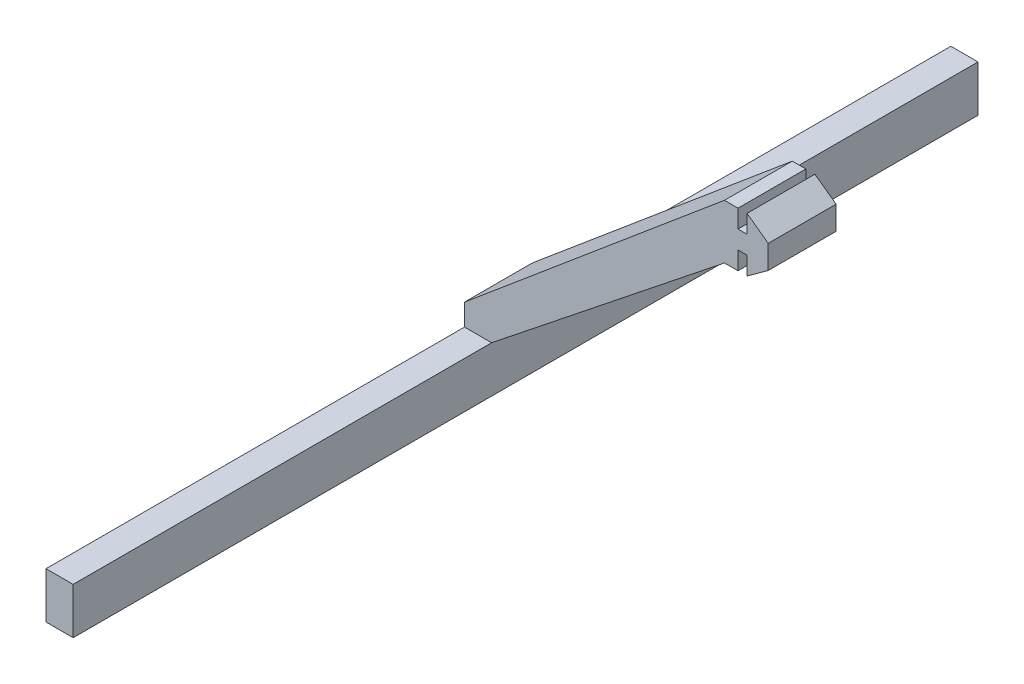
ISO-10303-21;
HEADER;
FILE_DESCRIPTION(('STEP AP214'),'2;1');
FILE_NAME('part.step','',(''),(''),'','','');
FILE_SCHEMA(('AUTOMOTIVE_DESIGN { 1 0 10303 214 1 1 1 1 }'));
ENDSEC;
DATA;
#1=APPLICATION_CONTEXT('core data for automotive mechanical design processes');
#2=APPLICATION_PROTOCOL_DEFINITION('international standard','automotive_design',2000,#1);
#3=PRODUCT_CONTEXT('',#1,'mechanical');
#4=PRODUCT('Part','Part','',(#3));
#5=PRODUCT_RELATED_PRODUCT_CATEGORY('part','',(#4));
#6=PRODUCT_DEFINITION_FORMATION('','',#4);
#7=PRODUCT_DEFINITION_CONTEXT('part definition',#1,'design');
#8=PRODUCT_DEFINITION('design','',#6,#7);
#9=PRODUCT_DEFINITION_SHAPE('','',#8);
#10=(LENGTH_UNIT() NAMED_UNIT(*) SI_UNIT(.MILLI.,.METRE.));
#11=(NAMED_UNIT(*) PLANE_ANGLE_UNIT() SI_UNIT($,.RADIAN.));
#12=(NAMED_UNIT(*) SI_UNIT($,.STERADIAN.) SOLID_ANGLE_UNIT());
#13=UNCERTAINTY_MEASURE_WITH_UNIT(LENGTH_MEASURE(1.E-05),#10,'distance_accuracy_value','');
#14=(GEOMETRIC_REPRESENTATION_CONTEXT(3) GLOBAL_UNCERTAINTY_ASSIGNED_CONTEXT((#13)) GLOBAL_UNIT_ASSIGNED_CONTEXT((#10,
#11,#12)) REPRESENTATION_CONTEXT('',''));
#15=CARTESIAN_POINT('',(0.,0.,0.));
#16=DIRECTION('',(0.,0.,1.));
#17=DIRECTION('',(1.,0.,0.));
#18=AXIS2_PLACEMENT_3D('',#15,#16,#17);
#19=CARTESIAN_POINT('',(0.,4.75939086294416,15.));
#20=DIRECTION('',(1.,0.,0.));
#21=DIRECTION('',(0.,1.,0.));
#22=AXIS2_PLACEMENT_3D('',#19,#20,#21);
#23=PLANE('',#22);
#24=DIRECTION('',(0.,0.,-1.));
#25=VECTOR('',#24,1.);
#26=CARTESIAN_POINT('',(0.,0.759390862944163,0.));
#27=LINE('',#26,#25);
#28=CARTESIAN_POINT('',(0.,0.759390862944163,15.));
#29=VERTEX_POINT('',#28);
#30=CARTESIAN_POINT('',(0.,0.759390862944163,0.));
#31=VERTEX_POINT('',#30);
#32=EDGE_CURVE('E276',#29,#31,#27,.T.);
#33=ORIENTED_EDGE('',*,*,#32,.F.);
#34=DIRECTION('',(0.,-1.,0.));
#35=VECTOR('',#34,1.);
#36=CARTESIAN_POINT('',(0.,4.75939086294416,15.));
#37=LINE('',#36,#35);
#38=CARTESIAN_POINT('',(0.,4.75939086294416,15.));
#39=VERTEX_POINT('',#38);
#40=EDGE_CURVE('E296',#39,#29,#37,.T.);
#41=ORIENTED_EDGE('',*,*,#40,.F.);
#42=DIRECTION('',(0.,0.,-1.));
#43=VECTOR('',#42,1.);
#44=CARTESIAN_POINT('',(0.,4.75939086294416,15.));
#45=LINE('',#44,#43);
#46=CARTESIAN_POINT('',(0.,4.75939086294416,0.));
#47=VERTEX_POINT('',#46);
#48=EDGE_CURVE('E306',#39,#47,#45,.T.);
#49=ORIENTED_EDGE('',*,*,#48,.T.);
#50=DIRECTION('',(0.,-1.,0.));
#51=VECTOR('',#50,1.);
#52=CARTESIAN_POINT('',(0.,4.75939086294416,0.));
#53=LINE('',#52,#51);
#54=EDGE_CURVE('E307',#47,#31,#53,.T.);
#55=ORIENTED_EDGE('',*,*,#54,.T.);
#56=EDGE_LOOP('',(#33,#41,#49,#55));
#57=FACE_BOUND('',#56,.T.);
#58=ADVANCED_FACE('F33',(#57),#23,.F.);
#59=DIRECTION('',(0.,0.,1.));
#60=VECTOR('',#59,1.);
#61=CARTESIAN_POINT('',(0.,-3.24060913705584,0.));
#62=LINE('',#61,#60);
#63=CARTESIAN_POINT('',(0.,-3.24060913705584,0.));
#64=VERTEX_POINT('',#63);
#65=CARTESIAN_POINT('',(0.,-3.24060913705584,15.));
#66=VERTEX_POINT('',#65);
#67=EDGE_CURVE('E271',#64,#66,#62,.T.);
#68=ORIENTED_EDGE('',*,*,#67,.F.);
#69=CARTESIAN_POINT('',(0.,-7.24060913705584,0.));
#70=VERTEX_POINT('',#69);
#71=EDGE_CURVE('E295',#64,#70,#53,.T.);
#72=ORIENTED_EDGE('',*,*,#71,.T.);
#73=DIRECTION('',(0.,0.,-1.));
#74=VECTOR('',#73,1.);
#75=CARTESIAN_POINT('',(0.,-7.24060913705584,15.));
#76=LINE('',#75,#74);
#77=CARTESIAN_POINT('',(0.,-7.24060913705584,15.));
#78=VERTEX_POINT('',#77);
#79=EDGE_CURVE('E11',#78,#70,#76,.T.);
#80=ORIENTED_EDGE('',*,*,#79,.F.);
#81=EDGE_CURVE('E300',#66,#78,#37,.T.);
#82=ORIENTED_EDGE('',*,*,#81,.F.);
#83=EDGE_LOOP('',(#68,#72,#80,#82));
#84=FACE_BOUND('',#83,.T.);
#85=ADVANCED_FACE('F387',(#84),#23,.F.);
#86=CARTESIAN_POINT('',(4.68,-3.84060913705584,15.));
#87=DIRECTION('',(-0.587760469668133,0.809034999425548,0.));
#88=DIRECTION('',(-0.809034999425548,-0.587760469668133,0.));
#89=AXIS2_PLACEMENT_3D('',#86,#87,#88);
#90=PLANE('',#89);
#91=DIRECTION('',(0.809034999425548,0.587760469668133,0.));
#92=VECTOR('',#91,1.);
#93=CARTESIAN_POINT('',(4.68,-3.84060913705584,0.));
#94=LINE('',#93,#92);
#95=CARTESIAN_POINT('',(4.68,-3.84060913705584,0.));
#96=VERTEX_POINT('',#95);
#97=EDGE_CURVE('E309',#70,#96,#94,.T.);
#98=ORIENTED_EDGE('',*,*,#97,.T.);
#99=DIRECTION('',(0.,0.,-1.));
#100=VECTOR('',#99,1.);
#101=CARTESIAN_POINT('',(4.68,-3.84060913705584,15.));
#102=LINE('',#101,#100);
#103=CARTESIAN_POINT('',(4.68,-3.84060913705584,15.));
#104=VERTEX_POINT('',#103);
#105=EDGE_CURVE('E40',#104,#96,#102,.T.);
#106=ORIENTED_EDGE('',*,*,#105,.F.);
#107=DIRECTION('',(0.809034999425548,0.587760469668133,0.));
#108=VECTOR('',#107,1.);
#109=CARTESIAN_POINT('',(4.68,-3.84060913705584,15.));
#110=LINE('',#109,#108);
#111=EDGE_CURVE('E299',#78,#104,#110,.T.);
#112=ORIENTED_EDGE('',*,*,#111,.F.);
#113=ORIENTED_EDGE('',*,*,#79,.T.);
#114=EDGE_LOOP('',(#98,#106,#112,#113));
#115=FACE_BOUND('',#114,.T.);
#116=ADVANCED_FACE('F388',(#115),#90,.F.);
#117=CARTESIAN_POINT('',(4.68,1.35939086294416,15.));
#118=DIRECTION('',(-1.,0.,0.));
#119=DIRECTION('',(0.,-1.,0.));
#120=AXIS2_PLACEMENT_3D('',#117,#118,#119);
#121=PLANE('',#120);
#122=DIRECTION('',(0.,1.,0.));
#123=VECTOR('',#122,1.);
#124=CARTESIAN_POINT('',(4.68,1.35939086294416,0.));
#125=LINE('',#124,#123);
#126=CARTESIAN_POINT('',(4.68,1.35939086294416,0.));
#127=VERTEX_POINT('',#126);
#128=EDGE_CURVE('E311',#96,#127,#125,.T.);
#129=ORIENTED_EDGE('',*,*,#128,.T.);
#130=DIRECTION('',(0.,0.,-1.));
#131=VECTOR('',#130,1.);
#132=CARTESIAN_POINT('',(4.68,1.35939086294416,15.));
#133=LINE('',#132,#131);
#134=CARTESIAN_POINT('',(4.68,1.35939086294416,15.));
#135=VERTEX_POINT('',#134);
#136=EDGE_CURVE('E317',#135,#127,#133,.T.);
#137=ORIENTED_EDGE('',*,*,#136,.F.);
#138=DIRECTION('',(0.,1.,0.));
#139=VECTOR('',#138,1.);
#140=CARTESIAN_POINT('',(4.68,1.35939086294416,15.));
#141=LINE('',#140,#139);
#142=EDGE_CURVE('E302',#104,#135,#141,.T.);
#143=ORIENTED_EDGE('',*,*,#142,.F.);
#144=ORIENTED_EDGE('',*,*,#105,.T.);
#145=EDGE_LOOP('',(#129,#137,#143,#144));
#146=FACE_BOUND('',#145,.T.);
#147=ADVANCED_FACE('F324',(#146),#121,.F.);
#148=CARTESIAN_POINT('',(0.,4.75939086294416,15.));
#149=DIRECTION('',(-0.587760469668133,-0.809034999425548,0.));
#150=DIRECTION('',(0.809034999425548,-0.587760469668133,0.));
#151=AXIS2_PLACEMENT_3D('',#148,#149,#150);
#152=PLANE('',#151);
#153=DIRECTION('',(-0.809034999425548,0.587760469668133,0.));
#154=VECTOR('',#153,1.);
#155=CARTESIAN_POINT('',(0.,4.75939086294416,0.));
#156=LINE('',#155,#154);
#157=EDGE_CURVE('E313',#127,#47,#156,.T.);
#158=ORIENTED_EDGE('',*,*,#157,.T.);
#159=ORIENTED_EDGE('',*,*,#48,.F.);
#160=DIRECTION('',(-0.809034999425548,0.587760469668133,0.));
#161=VECTOR('',#160,1.);
#162=CARTESIAN_POINT('',(0.,4.75939086294416,15.));
#163=LINE('',#162,#161);
#164=EDGE_CURVE('E304',#135,#39,#163,.T.);
#165=ORIENTED_EDGE('',*,*,#164,.F.);
#166=ORIENTED_EDGE('',*,*,#136,.T.);
#167=EDGE_LOOP('',(#158,#159,#165,#166));
#168=FACE_BOUND('',#167,.T.);
#169=ADVANCED_FACE('F335',(#168),#152,.F.);
#170=CARTESIAN_POINT('',(0.,0.,15.));
#171=DIRECTION('',(0.,0.,-1.));
#172=DIRECTION('',(-1.,0.,0.));
#173=AXIS2_PLACEMENT_3D('',#170,#171,#172);
#174=PLANE('',#173);
#175=DIRECTION('',(0.,1.,0.));
#176=VECTOR('',#175,1.);
#177=CARTESIAN_POINT('',(-62.4533332339231,-58.4496798635466,15.));
#178=LINE('',#177,#176);
#179=CARTESIAN_POINT('',(-62.4533332339231,-48.2296798635466,15.));
#180=VERTEX_POINT('',#179);
#181=CARTESIAN_POINT('',(-62.4533332339231,-43.4496798635466,15.));
#182=VERTEX_POINT('',#181);
#183=EDGE_CURVE('E224',#180,#182,#178,.T.);
#184=ORIENTED_EDGE('',*,*,#183,.F.);
#185=DIRECTION('',(1.,0.,0.));
#186=VECTOR('',#185,1.);
#187=CARTESIAN_POINT('',(0.,-48.2296798635466,15.));
#188=LINE('',#187,#186);
#189=CARTESIAN_POINT('',(-56.4533332339231,-48.2296798635466,15.));
#190=VERTEX_POINT('',#189);
#191=EDGE_CURVE('E212',#180,#190,#188,.T.);
#192=ORIENTED_EDGE('',*,*,#191,.T.);
#193=DIRECTION('',(0.,1.,0.));
#194=VECTOR('',#193,1.);
#195=CARTESIAN_POINT('',(-56.4533332339231,-58.4496798635466,15.));
#196=LINE('',#195,#194);
#197=CARTESIAN_POINT('',(-56.4533332339231,-48.2294046692249,15.));
#198=VERTEX_POINT('',#197);
#199=EDGE_CURVE('E186',#190,#198,#196,.T.);
#200=ORIENTED_EDGE('',*,*,#199,.T.);
#201=DIRECTION('',(-0.782156445030785,-0.623082093705801,0.));
#202=VECTOR('',#201,1.);
#203=CARTESIAN_POINT('',(-50.4533332339231,-43.4496798635466,15.));
#204=LINE('',#203,#202);
#205=CARTESIAN_POINT('',(-5.,-7.24060913705584,15.));
#206=VERTEX_POINT('',#205);
#207=EDGE_CURVE('E228',#206,#198,#204,.T.);
#208=ORIENTED_EDGE('',*,*,#207,.F.);
#209=DIRECTION('',(1.,0.,0.));
#210=VECTOR('',#209,1.);
#211=CARTESIAN_POINT('',(-5.,-7.24060913705584,15.));
#212=LINE('',#211,#210);
#213=CARTESIAN_POINT('',(-2.,-7.24060913705584,15.));
#214=VERTEX_POINT('',#213);
#215=EDGE_CURVE('E265',#206,#214,#212,.T.);
#216=ORIENTED_EDGE('',*,*,#215,.T.);
#217=DIRECTION('',(0.,1.,0.));
#218=VECTOR('',#217,1.);
#219=CARTESIAN_POINT('',(-2.,4.75939086294416,15.));
#220=LINE('',#219,#218);
#221=CARTESIAN_POINT('',(-2.,-3.24060913705584,15.));
#222=VERTEX_POINT('',#221);
#223=EDGE_CURVE('E256',#214,#222,#220,.T.);
#224=ORIENTED_EDGE('',*,*,#223,.T.);
#225=DIRECTION('',(1.,0.,0.));
#226=VECTOR('',#225,1.);
#227=CARTESIAN_POINT('',(-2.,-3.24060913705584,15.));
#228=LINE('',#227,#226);
#229=EDGE_CURVE('E289',#222,#66,#228,.T.);
#230=ORIENTED_EDGE('',*,*,#229,.T.);
#231=ORIENTED_EDGE('',*,*,#81,.T.);
#232=ORIENTED_EDGE('',*,*,#111,.T.);
#233=ORIENTED_EDGE('',*,*,#142,.T.);
#234=ORIENTED_EDGE('',*,*,#164,.T.);
#235=ORIENTED_EDGE('',*,*,#40,.T.);
#236=DIRECTION('',(1.,0.,0.));
#237=VECTOR('',#236,1.);
#238=CARTESIAN_POINT('',(-2.,0.759390862944162,15.));
#239=LINE('',#238,#237);
#240=CARTESIAN_POINT('',(-2.,0.759390862944162,15.));
#241=VERTEX_POINT('',#240);
#242=EDGE_CURVE('E286',#241,#29,#239,.T.);
#243=ORIENTED_EDGE('',*,*,#242,.F.);
#244=CARTESIAN_POINT('',(-2.,4.75939086294416,15.));
#245=VERTEX_POINT('',#244);
#246=EDGE_CURVE('E255',#241,#245,#220,.T.);
#247=ORIENTED_EDGE('',*,*,#246,.T.);
#248=DIRECTION('',(1.,0.,0.));
#249=VECTOR('',#248,1.);
#250=CARTESIAN_POINT('',(-5.,4.75939086294416,15.));
#251=LINE('',#250,#249);
#252=CARTESIAN_POINT('',(-5.,4.75939086294416,15.));
#253=VERTEX_POINT('',#252);
#254=EDGE_CURVE('E262',#253,#245,#251,.T.);
#255=ORIENTED_EDGE('',*,*,#254,.F.);
#256=DIRECTION('',(0.766044443118974,0.642787609686543,0.));
#257=VECTOR('',#256,1.);
#258=CARTESIAN_POINT('',(-5.,4.75939086294416,15.));
#259=LINE('',#258,#257);
#260=EDGE_CURVE('E231',#182,#253,#259,.T.);
#261=ORIENTED_EDGE('',*,*,#260,.F.);
#262=EDGE_LOOP('',(#184,#192,#200,#208,#216,#224,#230,#231,#232,#233,#234,#235,#243,#247,#255,#261));
#263=FACE_BOUND('',#262,.T.);
#264=ADVANCED_FACE('F341',(#263),#174,.F.);
#265=CARTESIAN_POINT('',(0.,0.,0.));
#266=DIRECTION('',(0.,0.,-1.));
#267=DIRECTION('',(-1.,0.,0.));
#268=AXIS2_PLACEMENT_3D('',#265,#266,#267);
#269=PLANE('',#268);
#270=DIRECTION('',(1.,0.,0.));
#271=VECTOR('',#270,1.);
#272=CARTESIAN_POINT('',(0.,-48.2296798635466,0.));
#273=LINE('',#272,#271);
#274=CARTESIAN_POINT('',(-62.4533332339231,-48.2296798635466,0.));
#275=VERTEX_POINT('',#274);
#276=CARTESIAN_POINT('',(-56.4533332339231,-48.2296798635466,0.));
#277=VERTEX_POINT('',#276);
#278=EDGE_CURVE('E205',#275,#277,#273,.T.);
#279=ORIENTED_EDGE('',*,*,#278,.F.);
#280=DIRECTION('',(0.,1.,0.));
#281=VECTOR('',#280,1.);
#282=CARTESIAN_POINT('',(-62.4533332339231,-58.4496798635466,0.));
#283=LINE('',#282,#281);
#284=CARTESIAN_POINT('',(-62.4533332339231,-43.4496798635466,0.));
#285=VERTEX_POINT('',#284);
#286=EDGE_CURVE('E222',#275,#285,#283,.T.);
#287=ORIENTED_EDGE('',*,*,#286,.T.);
#288=DIRECTION('',(0.766044443118974,0.642787609686543,0.));
#289=VECTOR('',#288,1.);
#290=CARTESIAN_POINT('',(-5.,4.75939086294416,0.));
#291=LINE('',#290,#289);
#292=CARTESIAN_POINT('',(-5.,4.75939086294416,0.));
#293=VERTEX_POINT('',#292);
#294=EDGE_CURVE('E232',#285,#293,#291,.T.);
#295=ORIENTED_EDGE('',*,*,#294,.T.);
#296=DIRECTION('',(1.,0.,0.));
#297=VECTOR('',#296,1.);
#298=CARTESIAN_POINT('',(-5.,4.75939086294416,0.));
#299=LINE('',#298,#297);
#300=CARTESIAN_POINT('',(-2.,4.75939086294416,0.));
#301=VERTEX_POINT('',#300);
#302=EDGE_CURVE('E249',#293,#301,#299,.T.);
#303=ORIENTED_EDGE('',*,*,#302,.T.);
#304=DIRECTION('',(0.,-1.,0.));
#305=VECTOR('',#304,1.);
#306=CARTESIAN_POINT('',(-2.,4.75939086294416,0.));
#307=LINE('',#306,#305);
#308=CARTESIAN_POINT('',(-2.,0.759390862944163,0.));
#309=VERTEX_POINT('',#308);
#310=EDGE_CURVE('E250',#301,#309,#307,.T.);
#311=ORIENTED_EDGE('',*,*,#310,.T.);
#312=DIRECTION('',(1.,0.,0.));
#313=VECTOR('',#312,1.);
#314=CARTESIAN_POINT('',(-2.,0.759390862944162,0.));
#315=LINE('',#314,#313);
#316=EDGE_CURVE('E279',#309,#31,#315,.T.);
#317=ORIENTED_EDGE('',*,*,#316,.T.);
#318=ORIENTED_EDGE('',*,*,#54,.F.);
#319=ORIENTED_EDGE('',*,*,#157,.F.);
#320=ORIENTED_EDGE('',*,*,#128,.F.);
#321=ORIENTED_EDGE('',*,*,#97,.F.);
#322=ORIENTED_EDGE('',*,*,#71,.F.);
#323=DIRECTION('',(1.,0.,0.));
#324=VECTOR('',#323,1.);
#325=CARTESIAN_POINT('',(-2.,-3.24060913705584,0.));
#326=LINE('',#325,#324);
#327=CARTESIAN_POINT('',(-2.,-3.24060913705584,0.));
#328=VERTEX_POINT('',#327);
#329=EDGE_CURVE('E292',#328,#64,#326,.T.);
#330=ORIENTED_EDGE('',*,*,#329,.F.);
#331=CARTESIAN_POINT('',(-2.,-7.24060913705584,0.));
#332=VERTEX_POINT('',#331);
#333=EDGE_CURVE('E241',#328,#332,#307,.T.);
#334=ORIENTED_EDGE('',*,*,#333,.T.);
#335=DIRECTION('',(1.,0.,0.));
#336=VECTOR('',#335,1.);
#337=CARTESIAN_POINT('',(-5.,-7.24060913705584,0.));
#338=LINE('',#337,#336);
#339=CARTESIAN_POINT('',(-5.,-7.24060913705584,0.));
#340=VERTEX_POINT('',#339);
#341=EDGE_CURVE('E268',#340,#332,#338,.T.);
#342=ORIENTED_EDGE('',*,*,#341,.F.);
#343=DIRECTION('',(-0.782156445030785,-0.623082093705801,0.));
#344=VECTOR('',#343,1.);
#345=CARTESIAN_POINT('',(-50.4533332339231,-43.4496798635466,0.));
#346=LINE('',#345,#344);
#347=CARTESIAN_POINT('',(-56.4533332339231,-48.2294046692249,0.));
#348=VERTEX_POINT('',#347);
#349=EDGE_CURVE('E227',#340,#348,#346,.T.);
#350=ORIENTED_EDGE('',*,*,#349,.T.);
#351=DIRECTION('',(0.,1.,0.));
#352=VECTOR('',#351,1.);
#353=CARTESIAN_POINT('',(-56.4533332339231,-58.4496798635466,0.));
#354=LINE('',#353,#352);
#355=EDGE_CURVE('E47',#277,#348,#354,.T.);
#356=ORIENTED_EDGE('',*,*,#355,.F.);
#357=EDGE_LOOP('',(#279,#287,#295,#303,#311,#317,#318,#319,#320,#321,#322,#330,#334,#342,#350,#356));
#358=FACE_BOUND('',#357,.T.);
#359=ADVANCED_FACE('F330',(#358),#269,.T.);
#360=CARTESIAN_POINT('',(-2.,-3.24060913705584,0.));
#361=DIRECTION('',(0.,1.,0.));
#362=DIRECTION('',(-1.,0.,0.));
#363=AXIS2_PLACEMENT_3D('',#360,#361,#362);
#364=PLANE('',#363);
#365=ORIENTED_EDGE('',*,*,#67,.T.);
#366=ORIENTED_EDGE('',*,*,#229,.F.);
#367=DIRECTION('',(0.,0.,1.));
#368=VECTOR('',#367,1.);
#369=CARTESIAN_POINT('',(-2.,-3.24060913705584,0.));
#370=LINE('',#369,#368);
#371=EDGE_CURVE('E272',#328,#222,#370,.T.);
#372=ORIENTED_EDGE('',*,*,#371,.F.);
#373=ORIENTED_EDGE('',*,*,#329,.T.);
#374=EDGE_LOOP('',(#365,#366,#372,#373));
#375=FACE_BOUND('',#374,.T.);
#376=ADVANCED_FACE('F384',(#375),#364,.F.);
#377=CARTESIAN_POINT('',(-2.,0.759390862944162,0.));
#378=DIRECTION('',(0.,-1.,0.));
#379=DIRECTION('',(1.,0.,0.));
#380=AXIS2_PLACEMENT_3D('',#377,#378,#379);
#381=PLANE('',#380);
#382=ORIENTED_EDGE('',*,*,#32,.T.);
#383=ORIENTED_EDGE('',*,*,#316,.F.);
#384=DIRECTION('',(0.,0.,-1.));
#385=VECTOR('',#384,1.);
#386=CARTESIAN_POINT('',(-2.,0.759390862944162,0.));
#387=LINE('',#386,#385);
#388=EDGE_CURVE('E275',#241,#309,#387,.T.);
#389=ORIENTED_EDGE('',*,*,#388,.F.);
#390=ORIENTED_EDGE('',*,*,#242,.T.);
#391=EDGE_LOOP('',(#382,#383,#389,#390));
#392=FACE_BOUND('',#391,.T.);
#393=ADVANCED_FACE('F344',(#392),#381,.F.);
#394=CARTESIAN_POINT('',(-2.,0.,0.));
#395=DIRECTION('',(-1.,0.,0.));
#396=DIRECTION('',(0.,-1.,0.));
#397=AXIS2_PLACEMENT_3D('',#394,#395,#396);
#398=PLANE('',#397);
#399=ORIENTED_EDGE('',*,*,#333,.F.);
#400=ORIENTED_EDGE('',*,*,#371,.T.);
#401=ORIENTED_EDGE('',*,*,#223,.F.);
#402=DIRECTION('',(0.,0.,1.));
#403=VECTOR('',#402,1.);
#404=CARTESIAN_POINT('',(-2.,-7.24060913705584,0.));
#405=LINE('',#404,#403);
#406=EDGE_CURVE('E253',#332,#214,#405,.T.);
#407=ORIENTED_EDGE('',*,*,#406,.F.);
#408=EDGE_LOOP('',(#399,#400,#401,#407));
#409=FACE_BOUND('',#408,.T.);
#410=ADVANCED_FACE('F381',(#409),#398,.F.);
#411=ORIENTED_EDGE('',*,*,#246,.F.);
#412=ORIENTED_EDGE('',*,*,#388,.T.);
#413=ORIENTED_EDGE('',*,*,#310,.F.);
#414=DIRECTION('',(0.,0.,-1.));
#415=VECTOR('',#414,1.);
#416=CARTESIAN_POINT('',(-2.,4.75939086294416,0.));
#417=LINE('',#416,#415);
#418=EDGE_CURVE('E246',#245,#301,#417,.T.);
#419=ORIENTED_EDGE('',*,*,#418,.F.);
#420=EDGE_LOOP('',(#411,#412,#413,#419));
#421=FACE_BOUND('',#420,.T.);
#422=ADVANCED_FACE('F349',(#421),#398,.F.);
#423=CARTESIAN_POINT('',(-5.,-7.24060913705584,0.));
#424=DIRECTION('',(0.,1.,0.));
#425=DIRECTION('',(-1.,0.,0.));
#426=AXIS2_PLACEMENT_3D('',#423,#424,#425);
#427=PLANE('',#426);
#428=ORIENTED_EDGE('',*,*,#406,.T.);
#429=ORIENTED_EDGE('',*,*,#215,.F.);
#430=DIRECTION('',(0.,0.,1.));
#431=VECTOR('',#430,1.);
#432=CARTESIAN_POINT('',(-5.,-7.24060913705584,0.));
#433=LINE('',#432,#431);
#434=EDGE_CURVE('E242',#340,#206,#433,.T.);
#435=ORIENTED_EDGE('',*,*,#434,.F.);
#436=ORIENTED_EDGE('',*,*,#341,.T.);
#437=EDGE_LOOP('',(#428,#429,#435,#436));
#438=FACE_BOUND('',#437,.T.);
#439=ADVANCED_FACE('F441',(#438),#427,.F.);
#440=CARTESIAN_POINT('',(-5.,4.75939086294416,0.));
#441=DIRECTION('',(0.,-1.,0.));
#442=DIRECTION('',(1.,0.,0.));
#443=AXIS2_PLACEMENT_3D('',#440,#441,#442);
#444=PLANE('',#443);
#445=ORIENTED_EDGE('',*,*,#418,.T.);
#446=ORIENTED_EDGE('',*,*,#302,.F.);
#447=DIRECTION('',(0.,0.,-1.));
#448=VECTOR('',#447,1.);
#449=CARTESIAN_POINT('',(-5.,4.75939086294416,0.));
#450=LINE('',#449,#448);
#451=EDGE_CURVE('E245',#253,#293,#450,.T.);
#452=ORIENTED_EDGE('',*,*,#451,.F.);
#453=ORIENTED_EDGE('',*,*,#254,.T.);
#454=EDGE_LOOP('',(#445,#446,#452,#453));
#455=FACE_BOUND('',#454,.T.);
#456=ADVANCED_FACE('F353',(#455),#444,.F.);
#457=CARTESIAN_POINT('',(-5.,4.75939086294416,15.));
#458=DIRECTION('',(-0.642787609686544,0.766044443118975,0.));
#459=DIRECTION('',(-0.766044443118975,-0.642787609686544,0.));
#460=AXIS2_PLACEMENT_3D('',#457,#458,#459);
#461=PLANE('',#460);
#462=ORIENTED_EDGE('',*,*,#294,.F.);
#463=DIRECTION('',(0.,0.,-1.));
#464=VECTOR('',#463,1.);
#465=CARTESIAN_POINT('',(-62.4533332339231,-43.4496798635466,15.));
#466=LINE('',#465,#464);
#467=EDGE_CURVE('E235',#182,#285,#466,.T.);
#468=ORIENTED_EDGE('',*,*,#467,.F.);
#469=ORIENTED_EDGE('',*,*,#260,.T.);
#470=ORIENTED_EDGE('',*,*,#451,.T.);
#471=EDGE_LOOP('',(#462,#468,#469,#470));
#472=FACE_BOUND('',#471,.T.);
#473=ADVANCED_FACE('F357',(#472),#461,.T.);
#474=CARTESIAN_POINT('',(-50.4533332339231,-43.4496798635466,15.));
#475=DIRECTION('',(0.623082093705801,-0.782156445030785,0.));
#476=DIRECTION('',(0.782156445030785,0.623082093705801,0.));
#477=AXIS2_PLACEMENT_3D('',#474,#475,#476);
#478=PLANE('',#477);
#479=ORIENTED_EDGE('',*,*,#349,.F.);
#480=ORIENTED_EDGE('',*,*,#434,.T.);
#481=ORIENTED_EDGE('',*,*,#207,.T.);
#482=DIRECTION('',(0.,0.,-1.));
#483=VECTOR('',#482,1.);
#484=CARTESIAN_POINT('',(-56.4533332339231,-48.2294046692249,15.));
#485=LINE('',#484,#483);
#486=EDGE_CURVE('E214',#198,#348,#485,.T.);
#487=ORIENTED_EDGE('',*,*,#486,.T.);
#488=EDGE_LOOP('',(#479,#480,#481,#487));
#489=FACE_BOUND('',#488,.T.);
#490=ADVANCED_FACE('F374',(#489),#478,.T.);
#491=CARTESIAN_POINT('',(-56.4533332339231,-58.4496798635466,15.));
#492=DIRECTION('',(-1.,0.,0.));
#493=DIRECTION('',(0.,0.,1.));
#494=AXIS2_PLACEMENT_3D('',#491,#492,#493);
#495=PLANE('',#494);
#496=ORIENTED_EDGE('',*,*,#199,.F.);
#497=DIRECTION('',(0.,0.,-1.));
#498=VECTOR('',#497,1.);
#499=CARTESIAN_POINT('',(-56.4533332339231,-48.2296798635466,107.5));
#500=LINE('',#499,#498);
#501=CARTESIAN_POINT('',(-56.4533332339231,-48.2296798635466,107.5));
#502=VERTEX_POINT('',#501);
#503=EDGE_CURVE('E172',#502,#190,#500,.T.);
#504=ORIENTED_EDGE('',*,*,#503,.F.);
#505=DIRECTION('',(0.,1.,0.));
#506=VECTOR('',#505,1.);
#507=CARTESIAN_POINT('',(-56.4533332339231,-48.2296798635466,107.5));
#508=LINE('',#507,#506);
#509=CARTESIAN_POINT('',(-56.4533332339231,-58.4496798635466,107.5));
#510=VERTEX_POINT('',#509);
#511=EDGE_CURVE('E184',#510,#502,#508,.T.);
#512=ORIENTED_EDGE('',*,*,#511,.F.);
#513=DIRECTION('',(0.,0.,1.));
#514=VECTOR('',#513,1.);
#515=CARTESIAN_POINT('',(-56.4533332339231,-58.4496798635466,15.));
#516=LINE('',#515,#514);
#517=CARTESIAN_POINT('',(-56.4533332339231,-58.4496798635466,-92.5));
#518=VERTEX_POINT('',#517);
#519=EDGE_CURVE('E217',#518,#510,#516,.T.);
#520=ORIENTED_EDGE('',*,*,#519,.F.);
#521=DIRECTION('',(0.,-1.,0.));
#522=VECTOR('',#521,1.);
#523=CARTESIAN_POINT('',(-56.4533332339231,-48.2296798635466,-92.5));
#524=LINE('',#523,#522);
#525=CARTESIAN_POINT('',(-56.4533332339231,-48.2296798635466,-92.5));
#526=VERTEX_POINT('',#525);
#527=EDGE_CURVE('E178',#526,#518,#524,.T.);
#528=ORIENTED_EDGE('',*,*,#527,.F.);
#529=EDGE_CURVE('E187',#277,#526,#500,.T.);
#530=ORIENTED_EDGE('',*,*,#529,.F.);
#531=ORIENTED_EDGE('',*,*,#355,.T.);
#532=ORIENTED_EDGE('',*,*,#486,.F.);
#533=EDGE_LOOP('',(#496,#504,#512,#520,#528,#530,#531,#532));
#534=FACE_BOUND('',#533,.T.);
#535=ADVANCED_FACE('F183',(#534),#495,.F.);
#536=CARTESIAN_POINT('',(-62.4533332339231,-58.4496798635466,15.));
#537=DIRECTION('',(1.,0.,0.));
#538=DIRECTION('',(0.,0.,-1.));
#539=AXIS2_PLACEMENT_3D('',#536,#537,#538);
#540=PLANE('',#539);
#541=ORIENTED_EDGE('',*,*,#286,.F.);
#542=DIRECTION('',(0.,0.,-1.));
#543=VECTOR('',#542,1.);
#544=CARTESIAN_POINT('',(-62.4533332339231,-48.2296798635466,107.5));
#545=LINE('',#544,#543);
#546=CARTESIAN_POINT('',(-62.4533332339231,-48.2296798635466,-92.5));
#547=VERTEX_POINT('',#546);
#548=EDGE_CURVE('E202',#275,#547,#545,.T.);
#549=ORIENTED_EDGE('',*,*,#548,.T.);
#550=DIRECTION('',(0.,-1.,0.));
#551=VECTOR('',#550,1.);
#552=CARTESIAN_POINT('',(-62.4533332339231,-48.2296798635466,-92.5));
#553=LINE('',#552,#551);
#554=CARTESIAN_POINT('',(-62.4533332339231,-58.4496798635466,-92.5));
#555=VERTEX_POINT('',#554);
#556=EDGE_CURVE('E193',#547,#555,#553,.T.);
#557=ORIENTED_EDGE('',*,*,#556,.T.);
#558=DIRECTION('',(0.,0.,-1.));
#559=VECTOR('',#558,1.);
#560=CARTESIAN_POINT('',(-62.4533332339231,-58.4496798635466,15.));
#561=LINE('',#560,#559);
#562=CARTESIAN_POINT('',(-62.4533332339231,-58.4496798635466,107.5));
#563=VERTEX_POINT('',#562);
#564=EDGE_CURVE('E219',#563,#555,#561,.T.);
#565=ORIENTED_EDGE('',*,*,#564,.F.);
#566=DIRECTION('',(0.,1.,0.));
#567=VECTOR('',#566,1.);
#568=CARTESIAN_POINT('',(-62.4533332339231,-48.2296798635466,107.5));
#569=LINE('',#568,#567);
#570=CARTESIAN_POINT('',(-62.4533332339231,-48.2296798635466,107.5));
#571=VERTEX_POINT('',#570);
#572=EDGE_CURVE('E200',#563,#571,#569,.T.);
#573=ORIENTED_EDGE('',*,*,#572,.T.);
#574=EDGE_CURVE('E55',#571,#180,#545,.T.);
#575=ORIENTED_EDGE('',*,*,#574,.T.);
#576=ORIENTED_EDGE('',*,*,#183,.T.);
#577=ORIENTED_EDGE('',*,*,#467,.T.);
#578=EDGE_LOOP('',(#541,#549,#557,#565,#573,#575,#576,#577));
#579=FACE_BOUND('',#578,.T.);
#580=ADVANCED_FACE('F358',(#579),#540,.F.);
#581=CARTESIAN_POINT('',(0.,-58.4496798635466,0.));
#582=DIRECTION('',(0.,1.,0.));
#583=DIRECTION('',(0.,0.,1.));
#584=AXIS2_PLACEMENT_3D('',#581,#582,#583);
#585=PLANE('',#584);
#586=ORIENTED_EDGE('',*,*,#519,.T.);
#587=DIRECTION('',(-1.,0.,0.));
#588=VECTOR('',#587,1.);
#589=CARTESIAN_POINT('',(-56.4533332339231,-58.4496798635466,107.5));
#590=LINE('',#589,#588);
#591=EDGE_CURVE('E192',#510,#563,#590,.T.);
#592=ORIENTED_EDGE('',*,*,#591,.T.);
#593=ORIENTED_EDGE('',*,*,#564,.T.);
#594=DIRECTION('',(-1.,0.,0.));
#595=VECTOR('',#594,1.);
#596=CARTESIAN_POINT('',(-56.4533332339231,-58.4496798635466,-92.5));
#597=LINE('',#596,#595);
#598=EDGE_CURVE('E206',#518,#555,#597,.T.);
#599=ORIENTED_EDGE('',*,*,#598,.F.);
#600=EDGE_LOOP('',(#586,#592,#593,#599));
#601=FACE_BOUND('',#600,.T.);
#602=ADVANCED_FACE('F370',(#601),#585,.F.);
#603=CARTESIAN_POINT('',(-56.4533332339231,-48.2296798635466,-92.5));
#604=DIRECTION('',(0.,0.,-1.));
#605=DIRECTION('',(0.,1.,0.));
#606=AXIS2_PLACEMENT_3D('',#603,#604,#605);
#607=PLANE('',#606);
#608=ORIENTED_EDGE('',*,*,#556,.F.);
#609=DIRECTION('',(-1.,0.,0.));
#610=VECTOR('',#609,1.);
#611=CARTESIAN_POINT('',(-56.4533332339231,-48.2296798635466,-92.5));
#612=LINE('',#611,#610);
#613=EDGE_CURVE('E177',#526,#547,#612,.T.);
#614=ORIENTED_EDGE('',*,*,#613,.F.);
#615=ORIENTED_EDGE('',*,*,#527,.T.);
#616=ORIENTED_EDGE('',*,*,#598,.T.);
#617=EDGE_LOOP('',(#608,#614,#615,#616));
#618=FACE_BOUND('',#617,.T.);
#619=ADVANCED_FACE('F367',(#618),#607,.T.);
#620=CARTESIAN_POINT('',(-56.4533332339231,-48.2296798635466,107.5));
#621=DIRECTION('',(0.,1.,0.));
#622=DIRECTION('',(0.,0.,1.));
#623=AXIS2_PLACEMENT_3D('',#620,#621,#622);
#624=PLANE('',#623);
#625=ORIENTED_EDGE('',*,*,#548,.F.);
#626=ORIENTED_EDGE('',*,*,#278,.T.);
#627=ORIENTED_EDGE('',*,*,#529,.T.);
#628=ORIENTED_EDGE('',*,*,#613,.T.);
#629=EDGE_LOOP('',(#625,#626,#627,#628));
#630=FACE_BOUND('',#629,.T.);
#631=ADVANCED_FACE('F362',(#630),#624,.T.);
#632=ORIENTED_EDGE('',*,*,#191,.F.);
#633=ORIENTED_EDGE('',*,*,#574,.F.);
#634=DIRECTION('',(-1.,0.,0.));
#635=VECTOR('',#634,1.);
#636=CARTESIAN_POINT('',(-56.4533332339231,-48.2296798635466,107.5));
#637=LINE('',#636,#635);
#638=EDGE_CURVE('E169',#502,#571,#637,.T.);
#639=ORIENTED_EDGE('',*,*,#638,.F.);
#640=ORIENTED_EDGE('',*,*,#503,.T.);
#641=EDGE_LOOP('',(#632,#633,#639,#640));
#642=FACE_BOUND('',#641,.T.);
#643=ADVANCED_FACE('F171',(#642),#624,.T.);
#644=CARTESIAN_POINT('',(-56.4533332339231,-48.2296798635466,107.5));
#645=DIRECTION('',(0.,0.,1.));
#646=DIRECTION('',(1.,0.,0.));
#647=AXIS2_PLACEMENT_3D('',#644,#645,#646);
#648=PLANE('',#647);
#649=ORIENTED_EDGE('',*,*,#572,.F.);
#650=ORIENTED_EDGE('',*,*,#591,.F.);
#651=ORIENTED_EDGE('',*,*,#511,.T.);
#652=ORIENTED_EDGE('',*,*,#638,.T.);
#653=EDGE_LOOP('',(#649,#650,#651,#652));
#654=FACE_BOUND('',#653,.T.);
#655=ADVANCED_FACE('F190',(#654),#648,.T.);
#656=CLOSED_SHELL('',(#58,#85,#116,#147,#169,#264,#359,#376,#393,#410,#422,#439,#456,#473,#490,
#535,#580,#602,#619,#631,#643,#655));
#657=MANIFOLD_SOLID_BREP('B2',#656);
#658=ADVANCED_BREP_SHAPE_REPRESENTATION('',(#18,#657),#14);
#659=SHAPE_DEFINITION_REPRESENTATION(#9,#658);
ENDSEC;
END-ISO-10303-21;
